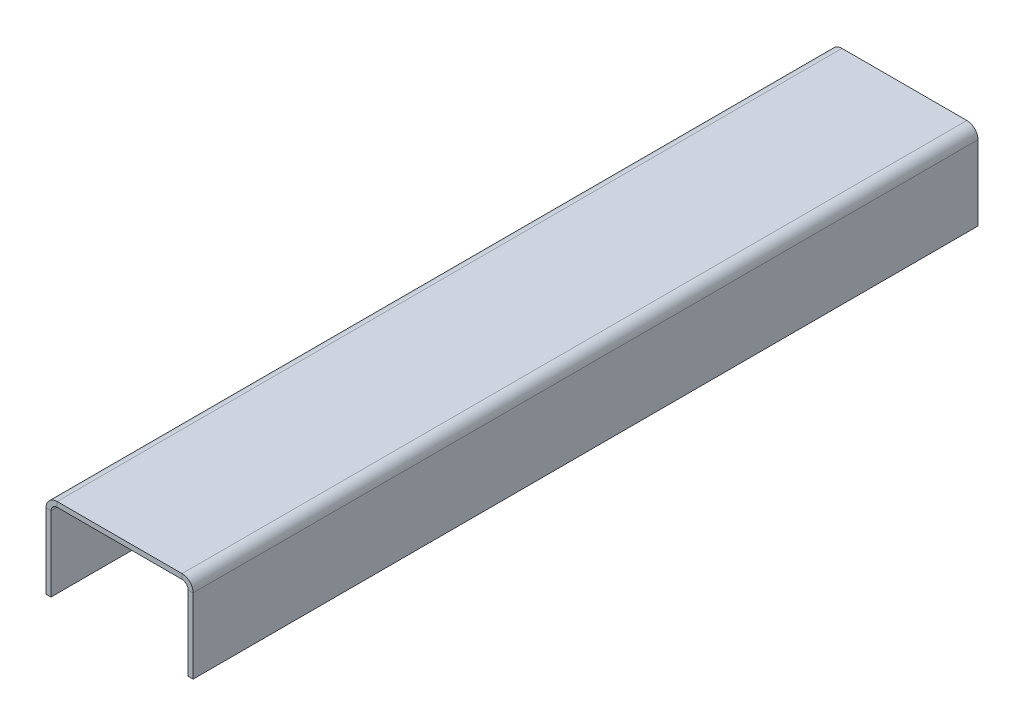
ISO-10303-21;
HEADER;
FILE_DESCRIPTION(('STEP AP214'),'2;1');
FILE_NAME('part.step','',(''),(''),'','','');
FILE_SCHEMA(('AUTOMOTIVE_DESIGN { 1 0 10303 214 1 1 1 1 }'));
ENDSEC;
DATA;
#1=APPLICATION_CONTEXT('core data for automotive mechanical design processes');
#2=APPLICATION_PROTOCOL_DEFINITION('international standard','automotive_design',2000,#1);
#3=PRODUCT_CONTEXT('',#1,'mechanical');
#4=PRODUCT('Part','Part','',(#3));
#5=PRODUCT_RELATED_PRODUCT_CATEGORY('part','',(#4));
#6=PRODUCT_DEFINITION_FORMATION('','',#4);
#7=PRODUCT_DEFINITION_CONTEXT('part definition',#1,'design');
#8=PRODUCT_DEFINITION('design','',#6,#7);
#9=PRODUCT_DEFINITION_SHAPE('','',#8);
#10=(LENGTH_UNIT() NAMED_UNIT(*) SI_UNIT(.MILLI.,.METRE.));
#11=(NAMED_UNIT(*) PLANE_ANGLE_UNIT() SI_UNIT($,.RADIAN.));
#12=(NAMED_UNIT(*) SI_UNIT($,.STERADIAN.) SOLID_ANGLE_UNIT());
#13=UNCERTAINTY_MEASURE_WITH_UNIT(LENGTH_MEASURE(1.E-05),#10,'distance_accuracy_value','');
#14=(GEOMETRIC_REPRESENTATION_CONTEXT(3) GLOBAL_UNCERTAINTY_ASSIGNED_CONTEXT((#13)) GLOBAL_UNIT_ASSIGNED_CONTEXT((#10,
#11,#12)) REPRESENTATION_CONTEXT('',''));
#15=CARTESIAN_POINT('',(0.,0.,0.));
#16=DIRECTION('',(0.,0.,1.));
#17=DIRECTION('',(1.,0.,0.));
#18=AXIS2_PLACEMENT_3D('',#15,#16,#17);
#19=CARTESIAN_POINT('',(38.1,-5.76326,406.4));
#20=DIRECTION('',(0.,0.,1.));
#21=DIRECTION('',(1.,0.,0.));
#22=AXIS2_PLACEMENT_3D('',#19,#20,#21);
#23=PLANE('',#22);
#24=DIRECTION('',(-1.,0.,0.));
#25=VECTOR('',#24,1.);
#26=CARTESIAN_POINT('',(38.1,-5.76326,406.4));
#27=LINE('',#26,#25);
#28=CARTESIAN_POINT('',(38.1,-5.76326,406.4));
#29=VERTEX_POINT('',#28);
#30=CARTESIAN_POINT('',(35.51174,-5.76326,406.4));
#31=VERTEX_POINT('',#30);
#32=EDGE_CURVE('E11',#29,#31,#27,.T.);
#33=ORIENTED_EDGE('',*,*,#32,.F.);
#34=CARTESIAN_POINT('',(32.33674,-5.76326,406.4));
#35=DIRECTION('',(0.,0.,-1.));
#36=DIRECTION('',(-1.,0.,0.));
#37=AXIS2_PLACEMENT_3D('',#34,#35,#36);
#38=CIRCLE('',#37,5.76326);
#39=CARTESIAN_POINT('',(32.3367399999999,0.,406.4));
#40=VERTEX_POINT('',#39);
#41=EDGE_CURVE('E149',#29,#40,#38,.F.);
#42=ORIENTED_EDGE('',*,*,#41,.T.);
#43=DIRECTION('',(0.,1.,0.));
#44=VECTOR('',#43,1.);
#45=CARTESIAN_POINT('',(32.3367399999999,-2.58826,406.4));
#46=LINE('',#45,#44);
#47=CARTESIAN_POINT('',(32.3367399999999,-2.58826,406.4));
#48=VERTEX_POINT('',#47);
#49=EDGE_CURVE('E47',#48,#40,#46,.T.);
#50=ORIENTED_EDGE('',*,*,#49,.F.);
#51=CARTESIAN_POINT('',(32.33674,-5.76326,406.4));
#52=DIRECTION('',(0.,0.,1.));
#53=DIRECTION('',(1.,0.,0.));
#54=AXIS2_PLACEMENT_3D('',#51,#52,#53);
#55=CIRCLE('',#54,3.175);
#56=EDGE_CURVE('E243',#31,#48,#55,.T.);
#57=ORIENTED_EDGE('',*,*,#56,.F.);
#58=EDGE_LOOP('',(#33,#42,#50,#57));
#59=FACE_BOUND('',#58,.T.);
#60=ADVANCED_FACE('F39',(#59),#23,.T.);
#61=CARTESIAN_POINT('',(32.3367399999999,-2.58826,406.4));
#62=DIRECTION('',(0.,0.,1.));
#63=DIRECTION('',(1.,0.,0.));
#64=AXIS2_PLACEMENT_3D('',#61,#62,#63);
#65=PLANE('',#64);
#66=DIRECTION('',(0.,1.,0.));
#67=VECTOR('',#66,1.);
#68=CARTESIAN_POINT('',(38.1,0.,406.4));
#69=LINE('',#68,#67);
#70=CARTESIAN_POINT('',(38.1,-44.45,406.4));
#71=VERTEX_POINT('',#70);
#72=EDGE_CURVE('E154',#71,#29,#69,.T.);
#73=ORIENTED_EDGE('',*,*,#72,.T.);
#74=ORIENTED_EDGE('',*,*,#32,.T.);
#75=DIRECTION('',(0.,1.,0.));
#76=VECTOR('',#75,1.);
#77=CARTESIAN_POINT('',(35.51174,0.,406.4));
#78=LINE('',#77,#76);
#79=CARTESIAN_POINT('',(35.51174,-44.45,406.4));
#80=VERTEX_POINT('',#79);
#81=EDGE_CURVE('E256',#80,#31,#78,.T.);
#82=ORIENTED_EDGE('',*,*,#81,.F.);
#83=DIRECTION('',(-1.,0.,0.));
#84=VECTOR('',#83,1.);
#85=CARTESIAN_POINT('',(38.1,-44.45,406.4));
#86=LINE('',#85,#84);
#87=EDGE_CURVE('E258',#71,#80,#86,.T.);
#88=ORIENTED_EDGE('',*,*,#87,.F.);
#89=EDGE_LOOP('',(#73,#74,#82,#88));
#90=FACE_BOUND('',#89,.T.);
#91=ADVANCED_FACE('F269',(#90),#65,.T.);
#92=CARTESIAN_POINT('',(32.3367399999999,0.,0.));
#93=DIRECTION('',(0.,0.,-1.));
#94=DIRECTION('',(-1.,0.,0.));
#95=AXIS2_PLACEMENT_3D('',#92,#93,#94);
#96=PLANE('',#95);
#97=DIRECTION('',(0.,-1.,0.));
#98=VECTOR('',#97,1.);
#99=CARTESIAN_POINT('',(32.3367399999999,0.,0.));
#100=LINE('',#99,#98);
#101=CARTESIAN_POINT('',(32.3367399999999,0.,0.));
#102=VERTEX_POINT('',#101);
#103=CARTESIAN_POINT('',(32.3367399999999,-2.58826,0.));
#104=VERTEX_POINT('',#103);
#105=EDGE_CURVE('E147',#102,#104,#100,.T.);
#106=ORIENTED_EDGE('',*,*,#105,.F.);
#107=CARTESIAN_POINT('',(32.33674,-5.76326,0.));
#108=DIRECTION('',(0.,0.,-1.));
#109=DIRECTION('',(-1.,0.,0.));
#110=AXIS2_PLACEMENT_3D('',#107,#108,#109);
#111=CIRCLE('',#110,5.76326);
#112=CARTESIAN_POINT('',(38.1,-5.76326,0.));
#113=VERTEX_POINT('',#112);
#114=EDGE_CURVE('E161',#113,#102,#111,.F.);
#115=ORIENTED_EDGE('',*,*,#114,.F.);
#116=DIRECTION('',(1.,0.,0.));
#117=VECTOR('',#116,1.);
#118=CARTESIAN_POINT('',(35.51174,-5.76326,0.));
#119=LINE('',#118,#117);
#120=CARTESIAN_POINT('',(35.51174,-5.76326,0.));
#121=VERTEX_POINT('',#120);
#122=EDGE_CURVE('E234',#121,#113,#119,.T.);
#123=ORIENTED_EDGE('',*,*,#122,.F.);
#124=CARTESIAN_POINT('',(32.33674,-5.76326,0.));
#125=DIRECTION('',(0.,0.,1.));
#126=DIRECTION('',(1.,0.,0.));
#127=AXIS2_PLACEMENT_3D('',#124,#125,#126);
#128=CIRCLE('',#127,3.175);
#129=EDGE_CURVE('E188',#121,#104,#128,.T.);
#130=ORIENTED_EDGE('',*,*,#129,.T.);
#131=EDGE_LOOP('',(#106,#115,#123,#130));
#132=FACE_BOUND('',#131,.T.);
#133=ADVANCED_FACE('F248',(#132),#96,.T.);
#134=CARTESIAN_POINT('',(35.51174,-5.76326,0.));
#135=DIRECTION('',(0.,0.,-1.));
#136=DIRECTION('',(-1.,0.,0.));
#137=AXIS2_PLACEMENT_3D('',#134,#135,#136);
#138=PLANE('',#137);
#139=DIRECTION('',(-1.,0.,0.));
#140=VECTOR('',#139,1.);
#141=CARTESIAN_POINT('',(-38.1,0.,0.));
#142=LINE('',#141,#140);
#143=CARTESIAN_POINT('',(-32.33674,0.,0.));
#144=VERTEX_POINT('',#143);
#145=EDGE_CURVE('E201',#102,#144,#142,.T.);
#146=ORIENTED_EDGE('',*,*,#145,.F.);
#147=ORIENTED_EDGE('',*,*,#105,.T.);
#148=DIRECTION('',(1.,0.,0.));
#149=VECTOR('',#148,1.);
#150=CARTESIAN_POINT('',(-38.1,-2.58826,0.));
#151=LINE('',#150,#149);
#152=CARTESIAN_POINT('',(-32.33674,-2.58826,0.));
#153=VERTEX_POINT('',#152);
#154=EDGE_CURVE('E186',#104,#153,#151,.F.);
#155=ORIENTED_EDGE('',*,*,#154,.T.);
#156=DIRECTION('',(0.,1.,0.));
#157=VECTOR('',#156,1.);
#158=CARTESIAN_POINT('',(-32.33674,-2.58826,0.));
#159=LINE('',#158,#157);
#160=EDGE_CURVE('E96',#153,#144,#159,.T.);
#161=ORIENTED_EDGE('',*,*,#160,.T.);
#162=EDGE_LOOP('',(#146,#147,#155,#161));
#163=FACE_BOUND('',#162,.T.);
#164=ADVANCED_FACE('F236',(#163),#138,.T.);
#165=CARTESIAN_POINT('',(-32.33674,0.,406.4));
#166=DIRECTION('',(0.,0.,1.));
#167=DIRECTION('',(1.,0.,0.));
#168=AXIS2_PLACEMENT_3D('',#165,#166,#167);
#169=PLANE('',#168);
#170=DIRECTION('',(0.,-1.,0.));
#171=VECTOR('',#170,1.);
#172=CARTESIAN_POINT('',(-32.33674,0.,406.4));
#173=LINE('',#172,#171);
#174=CARTESIAN_POINT('',(-32.33674,0.,406.4));
#175=VERTEX_POINT('',#174);
#176=CARTESIAN_POINT('',(-32.33674,-2.58826,406.4));
#177=VERTEX_POINT('',#176);
#178=EDGE_CURVE('E232',#175,#177,#173,.T.);
#179=ORIENTED_EDGE('',*,*,#178,.F.);
#180=CARTESIAN_POINT('',(-32.33674,-5.76326,406.4));
#181=DIRECTION('',(0.,0.,-1.));
#182=DIRECTION('',(-1.,0.,0.));
#183=AXIS2_PLACEMENT_3D('',#180,#181,#182);
#184=CIRCLE('',#183,5.76326);
#185=CARTESIAN_POINT('',(-38.1,-5.76326,406.4));
#186=VERTEX_POINT('',#185);
#187=EDGE_CURVE('E169',#175,#186,#184,.F.);
#188=ORIENTED_EDGE('',*,*,#187,.T.);
#189=DIRECTION('',(-1.,0.,0.));
#190=VECTOR('',#189,1.);
#191=CARTESIAN_POINT('',(-35.51174,-5.76326,406.4));
#192=LINE('',#191,#190);
#193=CARTESIAN_POINT('',(-35.51174,-5.76326,406.4));
#194=VERTEX_POINT('',#193);
#195=EDGE_CURVE('E55',#194,#186,#192,.T.);
#196=ORIENTED_EDGE('',*,*,#195,.F.);
#197=CARTESIAN_POINT('',(-32.33674,-5.76326,406.4));
#198=DIRECTION('',(0.,0.,1.));
#199=DIRECTION('',(1.,0.,0.));
#200=AXIS2_PLACEMENT_3D('',#197,#198,#199);
#201=CIRCLE('',#200,3.175);
#202=EDGE_CURVE('E260',#177,#194,#201,.T.);
#203=ORIENTED_EDGE('',*,*,#202,.F.);
#204=EDGE_LOOP('',(#179,#188,#196,#203));
#205=FACE_BOUND('',#204,.T.);
#206=ADVANCED_FACE('F295',(#205),#169,.T.);
#207=CARTESIAN_POINT('',(-35.51174,-5.76326,406.4));
#208=DIRECTION('',(0.,0.,1.));
#209=DIRECTION('',(1.,0.,0.));
#210=AXIS2_PLACEMENT_3D('',#207,#208,#209);
#211=PLANE('',#210);
#212=DIRECTION('',(-1.,0.,0.));
#213=VECTOR('',#212,1.);
#214=CARTESIAN_POINT('',(-38.1,0.,406.4));
#215=LINE('',#214,#213);
#216=EDGE_CURVE('E139',#40,#175,#215,.T.);
#217=ORIENTED_EDGE('',*,*,#216,.T.);
#218=ORIENTED_EDGE('',*,*,#178,.T.);
#219=DIRECTION('',(1.,0.,0.));
#220=VECTOR('',#219,1.);
#221=CARTESIAN_POINT('',(-38.1,-2.58826,406.4));
#222=LINE('',#221,#220);
#223=EDGE_CURVE('E142',#48,#177,#222,.F.);
#224=ORIENTED_EDGE('',*,*,#223,.F.);
#225=ORIENTED_EDGE('',*,*,#49,.T.);
#226=EDGE_LOOP('',(#217,#218,#224,#225));
#227=FACE_BOUND('',#226,.T.);
#228=ADVANCED_FACE('F137',(#227),#211,.T.);
#229=CARTESIAN_POINT('',(-38.1,-5.76326,0.));
#230=DIRECTION('',(0.,0.,-1.));
#231=DIRECTION('',(-1.,0.,0.));
#232=AXIS2_PLACEMENT_3D('',#229,#230,#231);
#233=PLANE('',#232);
#234=DIRECTION('',(1.,0.,0.));
#235=VECTOR('',#234,1.);
#236=CARTESIAN_POINT('',(-38.1,-5.76326,0.));
#237=LINE('',#236,#235);
#238=CARTESIAN_POINT('',(-38.1,-5.76326,0.));
#239=VERTEX_POINT('',#238);
#240=CARTESIAN_POINT('',(-35.51174,-5.76326,0.));
#241=VERTEX_POINT('',#240);
#242=EDGE_CURVE('E103',#239,#241,#237,.T.);
#243=ORIENTED_EDGE('',*,*,#242,.F.);
#244=CARTESIAN_POINT('',(-32.33674,-5.76326,0.));
#245=DIRECTION('',(0.,0.,-1.));
#246=DIRECTION('',(-1.,0.,0.));
#247=AXIS2_PLACEMENT_3D('',#244,#245,#246);
#248=CIRCLE('',#247,5.76326);
#249=EDGE_CURVE('E203',#144,#239,#248,.F.);
#250=ORIENTED_EDGE('',*,*,#249,.F.);
#251=ORIENTED_EDGE('',*,*,#160,.F.);
#252=CARTESIAN_POINT('',(-32.33674,-5.76326,0.));
#253=DIRECTION('',(0.,0.,1.));
#254=DIRECTION('',(1.,0.,0.));
#255=AXIS2_PLACEMENT_3D('',#252,#253,#254);
#256=CIRCLE('',#255,3.175);
#257=EDGE_CURVE('E184',#153,#241,#256,.T.);
#258=ORIENTED_EDGE('',*,*,#257,.T.);
#259=EDGE_LOOP('',(#243,#250,#251,#258));
#260=FACE_BOUND('',#259,.T.);
#261=ADVANCED_FACE('F301',(#260),#233,.T.);
#262=CARTESIAN_POINT('',(-32.33674,-2.58826,0.));
#263=DIRECTION('',(0.,0.,-1.));
#264=DIRECTION('',(-1.,0.,0.));
#265=AXIS2_PLACEMENT_3D('',#262,#263,#264);
#266=PLANE('',#265);
#267=DIRECTION('',(0.,-1.,0.));
#268=VECTOR('',#267,1.);
#269=CARTESIAN_POINT('',(-38.1,0.,0.));
#270=LINE('',#269,#268);
#271=CARTESIAN_POINT('',(-38.1,-44.45,0.));
#272=VERTEX_POINT('',#271);
#273=EDGE_CURVE('E175',#239,#272,#270,.T.);
#274=ORIENTED_EDGE('',*,*,#273,.F.);
#275=ORIENTED_EDGE('',*,*,#242,.T.);
#276=DIRECTION('',(0.,1.,0.));
#277=VECTOR('',#276,1.);
#278=CARTESIAN_POINT('',(-35.51174,0.,0.));
#279=LINE('',#278,#277);
#280=CARTESIAN_POINT('',(-35.51174,-44.45,0.));
#281=VERTEX_POINT('',#280);
#282=EDGE_CURVE('E181',#241,#281,#279,.F.);
#283=ORIENTED_EDGE('',*,*,#282,.T.);
#284=DIRECTION('',(-1.,0.,0.));
#285=VECTOR('',#284,1.);
#286=CARTESIAN_POINT('',(-35.51174,-44.45,0.));
#287=LINE('',#286,#285);
#288=EDGE_CURVE('E178',#281,#272,#287,.T.);
#289=ORIENTED_EDGE('',*,*,#288,.T.);
#290=EDGE_LOOP('',(#274,#275,#283,#289));
#291=FACE_BOUND('',#290,.T.);
#292=ADVANCED_FACE('F304',(#291),#266,.T.);
#293=CARTESIAN_POINT('',(-38.1,0.,406.4));
#294=DIRECTION('',(1.,0.,0.));
#295=DIRECTION('',(0.,0.,-1.));
#296=AXIS2_PLACEMENT_3D('',#293,#294,#295);
#297=PLANE('',#296);
#298=ORIENTED_EDGE('',*,*,#273,.T.);
#299=DIRECTION('',(0.,0.,-1.));
#300=VECTOR('',#299,1.);
#301=CARTESIAN_POINT('',(-38.1,-44.45,406.4));
#302=LINE('',#301,#300);
#303=CARTESIAN_POINT('',(-38.1,-44.45,406.4));
#304=VERTEX_POINT('',#303);
#305=EDGE_CURVE('E227',#304,#272,#302,.T.);
#306=ORIENTED_EDGE('',*,*,#305,.F.);
#307=DIRECTION('',(0.,-1.,0.));
#308=VECTOR('',#307,1.);
#309=CARTESIAN_POINT('',(-38.1,0.,406.4));
#310=LINE('',#309,#308);
#311=EDGE_CURVE('E109',#186,#304,#310,.T.);
#312=ORIENTED_EDGE('',*,*,#311,.F.);
#313=DIRECTION('',(0.,0.,-1.));
#314=VECTOR('',#313,1.);
#315=CARTESIAN_POINT('',(-38.1,-5.76326,406.4));
#316=LINE('',#315,#314);
#317=EDGE_CURVE('E171',#186,#239,#316,.T.);
#318=ORIENTED_EDGE('',*,*,#317,.T.);
#319=EDGE_LOOP('',(#298,#306,#312,#318));
#320=FACE_BOUND('',#319,.T.);
#321=ADVANCED_FACE('F307',(#320),#297,.F.);
#322=CARTESIAN_POINT('',(-35.51174,-44.45,406.4));
#323=DIRECTION('',(0.,-1.,0.));
#324=DIRECTION('',(0.,0.,-1.));
#325=AXIS2_PLACEMENT_3D('',#322,#323,#324);
#326=PLANE('',#325);
#327=ORIENTED_EDGE('',*,*,#288,.F.);
#328=DIRECTION('',(0.,0.,-1.));
#329=VECTOR('',#328,1.);
#330=CARTESIAN_POINT('',(-35.51174,-44.45,406.4));
#331=LINE('',#330,#329);
#332=CARTESIAN_POINT('',(-35.51174,-44.45,406.4));
#333=VERTEX_POINT('',#332);
#334=EDGE_CURVE('E225',#333,#281,#331,.T.);
#335=ORIENTED_EDGE('',*,*,#334,.F.);
#336=DIRECTION('',(-1.,0.,0.));
#337=VECTOR('',#336,1.);
#338=CARTESIAN_POINT('',(-35.51174,-44.45,406.4));
#339=LINE('',#338,#337);
#340=EDGE_CURVE('E515',#333,#304,#339,.T.);
#341=ORIENTED_EDGE('',*,*,#340,.T.);
#342=ORIENTED_EDGE('',*,*,#305,.T.);
#343=EDGE_LOOP('',(#327,#335,#341,#342));
#344=FACE_BOUND('',#343,.T.);
#345=ADVANCED_FACE('F311',(#344),#326,.T.);
#346=CARTESIAN_POINT('',(-35.51174,0.,406.4));
#347=DIRECTION('',(1.,0.,0.));
#348=DIRECTION('',(0.,0.,-1.));
#349=AXIS2_PLACEMENT_3D('',#346,#347,#348);
#350=PLANE('',#349);
#351=ORIENTED_EDGE('',*,*,#282,.F.);
#352=DIRECTION('',(0.,0.,-1.));
#353=VECTOR('',#352,1.);
#354=CARTESIAN_POINT('',(-35.51174,-5.76326,406.4));
#355=LINE('',#354,#353);
#356=EDGE_CURVE('E222',#194,#241,#355,.T.);
#357=ORIENTED_EDGE('',*,*,#356,.F.);
#358=DIRECTION('',(0.,1.,0.));
#359=VECTOR('',#358,1.);
#360=CARTESIAN_POINT('',(-35.51174,0.,406.4));
#361=LINE('',#360,#359);
#362=EDGE_CURVE('E517',#194,#333,#361,.F.);
#363=ORIENTED_EDGE('',*,*,#362,.T.);
#364=ORIENTED_EDGE('',*,*,#334,.T.);
#365=EDGE_LOOP('',(#351,#357,#363,#364));
#366=FACE_BOUND('',#365,.T.);
#367=ADVANCED_FACE('F315',(#366),#350,.T.);
#368=CARTESIAN_POINT('',(-32.33674,-5.76326,406.4));
#369=DIRECTION('',(0.,0.,-1.));
#370=DIRECTION('',(-1.,0.,0.));
#371=AXIS2_PLACEMENT_3D('',#368,#369,#370);
#372=CYLINDRICAL_SURFACE('',#371,3.175);
#373=ORIENTED_EDGE('',*,*,#257,.F.);
#374=DIRECTION('',(0.,0.,-1.));
#375=VECTOR('',#374,1.);
#376=CARTESIAN_POINT('',(-32.33674,-2.58826,406.4));
#377=LINE('',#376,#375);
#378=EDGE_CURVE('E219',#177,#153,#377,.T.);
#379=ORIENTED_EDGE('',*,*,#378,.F.);
#380=ORIENTED_EDGE('',*,*,#202,.T.);
#381=ORIENTED_EDGE('',*,*,#356,.T.);
#382=EDGE_LOOP('',(#373,#379,#380,#381));
#383=FACE_BOUND('',#382,.T.);
#384=ADVANCED_FACE('F319',(#383),#372,.F.);
#385=CARTESIAN_POINT('',(-38.1,-2.58826,406.4));
#386=DIRECTION('',(0.,-1.,0.));
#387=DIRECTION('',(0.,0.,-1.));
#388=AXIS2_PLACEMENT_3D('',#385,#386,#387);
#389=PLANE('',#388);
#390=ORIENTED_EDGE('',*,*,#154,.F.);
#391=DIRECTION('',(0.,0.,-1.));
#392=VECTOR('',#391,1.);
#393=CARTESIAN_POINT('',(32.3367399999999,-2.58826,406.4));
#394=LINE('',#393,#392);
#395=EDGE_CURVE('E216',#48,#104,#394,.T.);
#396=ORIENTED_EDGE('',*,*,#395,.F.);
#397=ORIENTED_EDGE('',*,*,#223,.T.);
#398=ORIENTED_EDGE('',*,*,#378,.T.);
#399=EDGE_LOOP('',(#390,#396,#397,#398));
#400=FACE_BOUND('',#399,.T.);
#401=ADVANCED_FACE('F245',(#400),#389,.T.);
#402=CARTESIAN_POINT('',(32.33674,-5.76326,406.4));
#403=DIRECTION('',(0.,0.,-1.));
#404=DIRECTION('',(-1.,0.,0.));
#405=AXIS2_PLACEMENT_3D('',#402,#403,#404);
#406=CYLINDRICAL_SURFACE('',#405,3.175);
#407=ORIENTED_EDGE('',*,*,#129,.F.);
#408=DIRECTION('',(0.,0.,-1.));
#409=VECTOR('',#408,1.);
#410=CARTESIAN_POINT('',(35.51174,-5.76326,406.4));
#411=LINE('',#410,#409);
#412=EDGE_CURVE('E213',#31,#121,#411,.T.);
#413=ORIENTED_EDGE('',*,*,#412,.F.);
#414=ORIENTED_EDGE('',*,*,#56,.T.);
#415=ORIENTED_EDGE('',*,*,#395,.T.);
#416=EDGE_LOOP('',(#407,#413,#414,#415));
#417=FACE_BOUND('',#416,.T.);
#418=ADVANCED_FACE('F241',(#417),#406,.F.);
#419=CARTESIAN_POINT('',(35.51174,0.,406.4));
#420=DIRECTION('',(-1.,0.,0.));
#421=DIRECTION('',(0.,0.,1.));
#422=AXIS2_PLACEMENT_3D('',#419,#420,#421);
#423=PLANE('',#422);
#424=DIRECTION('',(0.,1.,0.));
#425=VECTOR('',#424,1.);
#426=CARTESIAN_POINT('',(35.51174,0.,0.));
#427=LINE('',#426,#425);
#428=CARTESIAN_POINT('',(35.51174,-44.45,0.));
#429=VERTEX_POINT('',#428);
#430=EDGE_CURVE('E191',#429,#121,#427,.T.);
#431=ORIENTED_EDGE('',*,*,#430,.F.);
#432=DIRECTION('',(0.,0.,-1.));
#433=VECTOR('',#432,1.);
#434=CARTESIAN_POINT('',(35.51174,-44.45,406.4));
#435=LINE('',#434,#433);
#436=EDGE_CURVE('E211',#80,#429,#435,.T.);
#437=ORIENTED_EDGE('',*,*,#436,.F.);
#438=ORIENTED_EDGE('',*,*,#81,.T.);
#439=ORIENTED_EDGE('',*,*,#412,.T.);
#440=EDGE_LOOP('',(#431,#437,#438,#439));
#441=FACE_BOUND('',#440,.T.);
#442=ADVANCED_FACE('F254',(#441),#423,.T.);
#443=CARTESIAN_POINT('',(38.1,-44.45,406.4));
#444=DIRECTION('',(0.,-1.,0.));
#445=DIRECTION('',(0.,0.,-1.));
#446=AXIS2_PLACEMENT_3D('',#443,#444,#445);
#447=PLANE('',#446);
#448=DIRECTION('',(-1.,0.,0.));
#449=VECTOR('',#448,1.);
#450=CARTESIAN_POINT('',(38.1,-44.45,0.));
#451=LINE('',#450,#449);
#452=CARTESIAN_POINT('',(38.1,-44.45,0.));
#453=VERTEX_POINT('',#452);
#454=EDGE_CURVE('E194',#453,#429,#451,.T.);
#455=ORIENTED_EDGE('',*,*,#454,.F.);
#456=DIRECTION('',(0.,0.,-1.));
#457=VECTOR('',#456,1.);
#458=CARTESIAN_POINT('',(38.1,-44.45,406.4));
#459=LINE('',#458,#457);
#460=EDGE_CURVE('E209',#71,#453,#459,.T.);
#461=ORIENTED_EDGE('',*,*,#460,.F.);
#462=ORIENTED_EDGE('',*,*,#87,.T.);
#463=ORIENTED_EDGE('',*,*,#436,.T.);
#464=EDGE_LOOP('',(#455,#461,#462,#463));
#465=FACE_BOUND('',#464,.T.);
#466=ADVANCED_FACE('F275',(#465),#447,.T.);
#467=CARTESIAN_POINT('',(38.1,0.,406.4));
#468=DIRECTION('',(-1.,0.,0.));
#469=DIRECTION('',(0.,0.,1.));
#470=AXIS2_PLACEMENT_3D('',#467,#468,#469);
#471=PLANE('',#470);
#472=DIRECTION('',(0.,1.,0.));
#473=VECTOR('',#472,1.);
#474=CARTESIAN_POINT('',(38.1,0.,0.));
#475=LINE('',#474,#473);
#476=EDGE_CURVE('E197',#453,#113,#475,.T.);
#477=ORIENTED_EDGE('',*,*,#476,.T.);
#478=DIRECTION('',(0.,0.,-1.));
#479=VECTOR('',#478,1.);
#480=CARTESIAN_POINT('',(38.1,-5.76326,406.4));
#481=LINE('',#480,#479);
#482=EDGE_CURVE('E163',#29,#113,#481,.T.);
#483=ORIENTED_EDGE('',*,*,#482,.F.);
#484=ORIENTED_EDGE('',*,*,#72,.F.);
#485=ORIENTED_EDGE('',*,*,#460,.T.);
#486=EDGE_LOOP('',(#477,#483,#484,#485));
#487=FACE_BOUND('',#486,.T.);
#488=ADVANCED_FACE('F271',(#487),#471,.F.);
#489=CARTESIAN_POINT('',(32.33674,-5.76326,406.4));
#490=DIRECTION('',(0.,0.,-1.));
#491=DIRECTION('',(-1.,0.,0.));
#492=AXIS2_PLACEMENT_3D('',#489,#490,#491);
#493=CYLINDRICAL_SURFACE('',#492,5.76326);
#494=ORIENTED_EDGE('',*,*,#114,.T.);
#495=DIRECTION('',(0.,0.,-1.));
#496=VECTOR('',#495,1.);
#497=CARTESIAN_POINT('',(32.3367399999999,0.,406.4));
#498=LINE('',#497,#496);
#499=EDGE_CURVE('E158',#40,#102,#498,.T.);
#500=ORIENTED_EDGE('',*,*,#499,.F.);
#501=ORIENTED_EDGE('',*,*,#41,.F.);
#502=ORIENTED_EDGE('',*,*,#482,.T.);
#503=EDGE_LOOP('',(#494,#500,#501,#502));
#504=FACE_BOUND('',#503,.T.);
#505=ADVANCED_FACE('F159',(#504),#493,.T.);
#506=CARTESIAN_POINT('',(-38.1,0.,406.4));
#507=DIRECTION('',(0.,-1.,0.));
#508=DIRECTION('',(0.,0.,-1.));
#509=AXIS2_PLACEMENT_3D('',#506,#507,#508);
#510=PLANE('',#509);
#511=ORIENTED_EDGE('',*,*,#145,.T.);
#512=DIRECTION('',(0.,0.,-1.));
#513=VECTOR('',#512,1.);
#514=CARTESIAN_POINT('',(-32.33674,0.,406.4));
#515=LINE('',#514,#513);
#516=EDGE_CURVE('E164',#175,#144,#515,.T.);
#517=ORIENTED_EDGE('',*,*,#516,.F.);
#518=ORIENTED_EDGE('',*,*,#216,.F.);
#519=ORIENTED_EDGE('',*,*,#499,.T.);
#520=EDGE_LOOP('',(#511,#517,#518,#519));
#521=FACE_BOUND('',#520,.T.);
#522=ADVANCED_FACE('F166',(#521),#510,.F.);
#523=CARTESIAN_POINT('',(-32.33674,-5.76326,406.4));
#524=DIRECTION('',(0.,0.,-1.));
#525=DIRECTION('',(-1.,0.,0.));
#526=AXIS2_PLACEMENT_3D('',#523,#524,#525);
#527=CYLINDRICAL_SURFACE('',#526,5.76326);
#528=ORIENTED_EDGE('',*,*,#249,.T.);
#529=ORIENTED_EDGE('',*,*,#317,.F.);
#530=ORIENTED_EDGE('',*,*,#187,.F.);
#531=ORIENTED_EDGE('',*,*,#516,.T.);
#532=EDGE_LOOP('',(#528,#529,#530,#531));
#533=FACE_BOUND('',#532,.T.);
#534=ADVANCED_FACE('F366',(#533),#527,.T.);
#535=CARTESIAN_POINT('',(-32.33674,-5.76326,406.4));
#536=DIRECTION('',(0.,0.,1.));
#537=DIRECTION('',(1.,0.,0.));
#538=AXIS2_PLACEMENT_3D('',#535,#536,#537);
#539=PLANE('',#538);
#540=ORIENTED_EDGE('',*,*,#311,.T.);
#541=ORIENTED_EDGE('',*,*,#340,.F.);
#542=ORIENTED_EDGE('',*,*,#362,.F.);
#543=ORIENTED_EDGE('',*,*,#195,.T.);
#544=EDGE_LOOP('',(#540,#541,#542,#543));
#545=FACE_BOUND('',#544,.T.);
#546=ADVANCED_FACE('F376',(#545),#539,.T.);
#547=CARTESIAN_POINT('',(-32.33674,-5.76326,0.));
#548=DIRECTION('',(0.,0.,1.));
#549=DIRECTION('',(1.,0.,0.));
#550=AXIS2_PLACEMENT_3D('',#547,#548,#549);
#551=PLANE('',#550);
#552=ORIENTED_EDGE('',*,*,#430,.T.);
#553=ORIENTED_EDGE('',*,*,#122,.T.);
#554=ORIENTED_EDGE('',*,*,#476,.F.);
#555=ORIENTED_EDGE('',*,*,#454,.T.);
#556=EDGE_LOOP('',(#552,#553,#554,#555));
#557=FACE_BOUND('',#556,.T.);
#558=ADVANCED_FACE('F273',(#557),#551,.F.);
#559=CLOSED_SHELL('',(#60,#91,#133,#164,#206,#228,#261,#292,#321,#345,#367,#384,#401,#418,#442,
#466,#488,#505,#522,#534,#546,#558));
#560=MANIFOLD_SOLID_BREP('B2',#559);
#561=ADVANCED_BREP_SHAPE_REPRESENTATION('',(#18,#560),#14);
#562=SHAPE_DEFINITION_REPRESENTATION(#9,#561);
ENDSEC;
END-ISO-10303-21;
